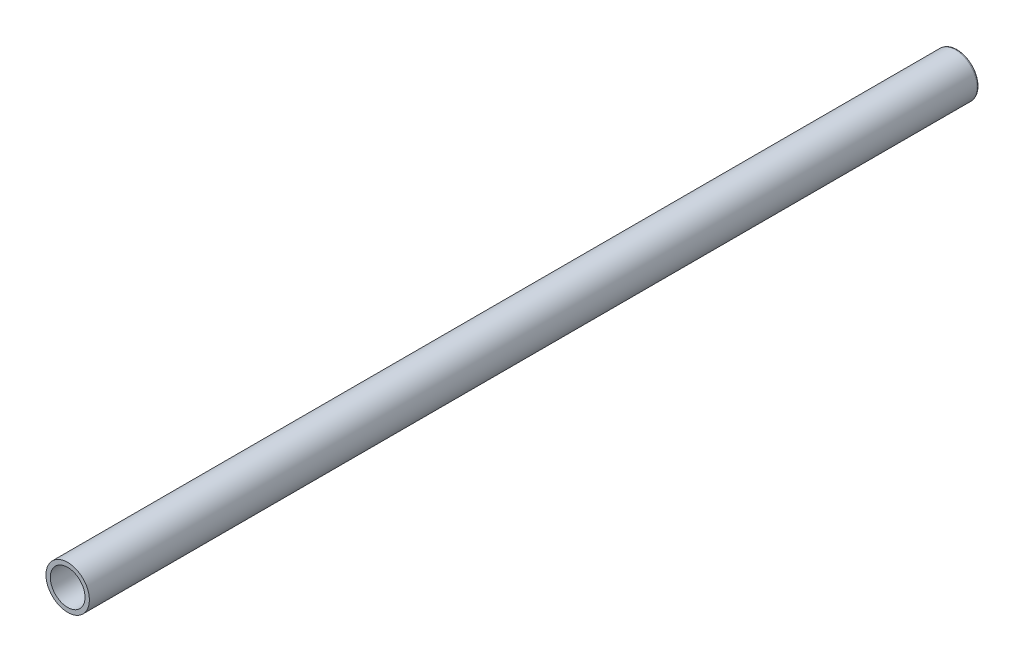
ISO-10303-21;
HEADER;
FILE_DESCRIPTION(('STEP AP214'),'2;1');
FILE_NAME('part.step','',(''),(''),'','','');
FILE_SCHEMA(('AUTOMOTIVE_DESIGN { 1 0 10303 214 1 1 1 1 }'));
ENDSEC;
DATA;
#1=APPLICATION_CONTEXT('core data for automotive mechanical design processes');
#2=APPLICATION_PROTOCOL_DEFINITION('international standard','automotive_design',2000,#1);
#3=PRODUCT_CONTEXT('',#1,'mechanical');
#4=PRODUCT('Part','Part','',(#3));
#5=PRODUCT_RELATED_PRODUCT_CATEGORY('part','',(#4));
#6=PRODUCT_DEFINITION_FORMATION('','',#4);
#7=PRODUCT_DEFINITION_CONTEXT('part definition',#1,'design');
#8=PRODUCT_DEFINITION('design','',#6,#7);
#9=PRODUCT_DEFINITION_SHAPE('','',#8);
#10=(LENGTH_UNIT() NAMED_UNIT(*) SI_UNIT(.MILLI.,.METRE.));
#11=(NAMED_UNIT(*) PLANE_ANGLE_UNIT() SI_UNIT($,.RADIAN.));
#12=(NAMED_UNIT(*) SI_UNIT($,.STERADIAN.) SOLID_ANGLE_UNIT());
#13=UNCERTAINTY_MEASURE_WITH_UNIT(LENGTH_MEASURE(1.E-05),#10,'distance_accuracy_value','');
#14=(GEOMETRIC_REPRESENTATION_CONTEXT(3) GLOBAL_UNCERTAINTY_ASSIGNED_CONTEXT((#13)) GLOBAL_UNIT_ASSIGNED_CONTEXT((#10,
#11,#12)) REPRESENTATION_CONTEXT('',''));
#15=CARTESIAN_POINT('',(0.,0.,0.));
#16=DIRECTION('',(0.,0.,1.));
#17=DIRECTION('',(1.,0.,0.));
#18=AXIS2_PLACEMENT_3D('',#15,#16,#17);
#19=CARTESIAN_POINT('',(0.,5.,124.656399009494));
#20=DIRECTION('',(0.,0.,-1.));
#21=DIRECTION('',(-1.,0.,0.));
#22=AXIS2_PLACEMENT_3D('',#19,#20,#21);
#23=PLANE('',#22);
#24=CARTESIAN_POINT('',(0.,0.,124.656399009494));
#25=DIRECTION('',(0.,0.,1.));
#26=DIRECTION('',(1.,0.,0.));
#27=AXIS2_PLACEMENT_3D('',#24,#25,#26);
#28=CIRCLE('',#27,4.);
#29=CARTESIAN_POINT('',(4.,0.,124.656399009494));
#30=VERTEX_POINT('',#29);
#31=EDGE_CURVE('E42',#30,#30,#28,.T.);
#32=ORIENTED_EDGE('',*,*,#31,.F.);
#33=EDGE_LOOP('',(#32));
#34=FACE_BOUND('',#33,.T.);
#35=CARTESIAN_POINT('',(0.,0.,124.656399009494));
#36=DIRECTION('',(0.,0.,1.));
#37=DIRECTION('',(1.,0.,0.));
#38=AXIS2_PLACEMENT_3D('',#35,#36,#37);
#39=CIRCLE('',#38,5.);
#40=CARTESIAN_POINT('',(5.,0.,124.656399009494));
#41=VERTEX_POINT('',#40);
#42=EDGE_CURVE('E105',#41,#41,#39,.T.);
#43=ORIENTED_EDGE('',*,*,#42,.T.);
#44=EDGE_LOOP('',(#43));
#45=FACE_BOUND('',#44,.T.);
#46=ADVANCED_FACE('F30',(#34,#45),#23,.F.);
#47=CARTESIAN_POINT('',(0.,0.,65.4068878857115));
#48=DIRECTION('',(0.,0.,1.));
#49=DIRECTION('',(1.,0.,0.));
#50=AXIS2_PLACEMENT_3D('',#47,#48,#49);
#51=CYLINDRICAL_SURFACE('',#50,4.);
#52=CARTESIAN_POINT('',(0.,0.,-79.8436009905056));
#53=DIRECTION('',(0.,0.,1.));
#54=DIRECTION('',(1.,0.,0.));
#55=AXIS2_PLACEMENT_3D('',#52,#53,#54);
#56=CIRCLE('',#55,4.);
#57=CARTESIAN_POINT('',(4.,0.,-79.8436009905056));
#58=VERTEX_POINT('',#57);
#59=EDGE_CURVE('E38',#58,#58,#56,.F.);
#60=ORIENTED_EDGE('',*,*,#59,.T.);
#61=EDGE_LOOP('',(#60));
#62=FACE_BOUND('',#61,.T.);
#63=CARTESIAN_POINT('',(-4.,0.,-66.3436009905056));
#64=CARTESIAN_POINT('',(-3.99999906578675,-0.0552507257798206,-66.3435994400135));
#65=CARTESIAN_POINT('',(-3.99884385421219,-0.110518771887176,-66.3390066233231));
#66=CARTESIAN_POINT('',(-3.99434742553262,-0.219470882513688,-66.3207842229676));
#67=CARTESIAN_POINT('',(-3.99100496946646,-0.273154031247157,-66.3071495174804));
#68=CARTESIAN_POINT('',(-3.98250417554693,-0.377347248121716,-66.2713081548642));
#69=CARTESIAN_POINT('',(-3.97734801894725,-0.427861042286669,-66.2491117913621));
#70=CARTESIAN_POINT('',(-3.96576895871729,-0.524448087936284,-66.1968133971424));
#71=CARTESIAN_POINT('',(-3.95934601236034,-0.570521189565836,-66.1667110997597));
#72=CARTESIAN_POINT('',(-3.94578275727868,-0.657867951533942,-66.0988004640695));
#73=CARTESIAN_POINT('',(-3.93863138099022,-0.699037126707379,-66.0608599405329));
#74=CARTESIAN_POINT('',(-3.92449080078353,-0.774499284802203,-65.9786328538997));
#75=CARTESIAN_POINT('',(-3.91750161525565,-0.808791491299424,-65.934345575208));
#76=CARTESIAN_POINT('',(-3.9043651713314,-0.870017695199355,-65.8398708393474));
#77=CARTESIAN_POINT('',(-3.89823196313737,-0.896834810616904,-65.7896055032987));
#78=CARTESIAN_POINT('',(-3.88766329874815,-0.941597939033684,-65.6851020494001));
#79=CARTESIAN_POINT('',(-3.88322757115193,-0.959545370292888,-65.6308645682885));
#80=CARTESIAN_POINT('',(-3.87666984478367,-0.985703224536193,-65.5211053250373));
#81=CARTESIAN_POINT('',(-3.87450327383617,-0.994101512222226,-65.4656310598058));
#82=CARTESIAN_POINT('',(-3.87259575025161,-1.00150785004523,-65.3540219444963));
#83=CARTESIAN_POINT('',(-3.87285440299096,-1.00051742787865,-65.2978872033732));
#84=CARTESIAN_POINT('',(-3.87572803664412,-0.989324349759518,-65.1879904520093));
#85=CARTESIAN_POINT('',(-3.87828575334586,-0.97934556012701,-65.1342039095289));
#86=CARTESIAN_POINT('',(-3.88537806450989,-0.950816124602065,-65.0290936232314));
#87=CARTESIAN_POINT('',(-3.88991279980464,-0.932264868046277,-64.977770055153));
#88=CARTESIAN_POINT('',(-3.90050075936125,-0.886926318624764,-64.8784423130043));
#89=CARTESIAN_POINT('',(-3.90656884979614,-0.860057778155269,-64.8304768759793));
#90=CARTESIAN_POINT('',(-3.91953140564257,-0.798904184009966,-64.7396551840011));
#91=CARTESIAN_POINT('',(-3.9264260155649,-0.764617832539223,-64.6967998251275));
#92=CARTESIAN_POINT('',(-3.94050587026521,-0.688442283120809,-64.616131913376));
#93=CARTESIAN_POINT('',(-3.94769379651981,-0.64636417211057,-64.5784979971314));
#94=CARTESIAN_POINT('',(-3.96137310385857,-0.556407945002462,-64.510786828863));
#95=CARTESIAN_POINT('',(-3.96786446366277,-0.50852965180529,-64.4807098076633));
#96=CARTESIAN_POINT('',(-3.97945154729455,-0.408077259120921,-64.4289005996894));
#97=CARTESIAN_POINT('',(-3.9845424008515,-0.355487595472408,-64.407197430336));
#98=CARTESIAN_POINT('',(-3.99271944660946,-0.247250672095248,-64.3729894533659));
#99=CARTESIAN_POINT('',(-3.99580602226187,-0.191603999433649,-64.3604828862269));
#100=CARTESIAN_POINT('',(-3.9995699951425,-0.0803599802600112,-64.3452959467998));
#101=CARTESIAN_POINT('',(-4.00030702338852,-0.024797813325467,-64.3423723064554));
#102=CARTESIAN_POINT('',(-3.999458698763,0.0860219165343426,-64.345766991876));
#103=CARTESIAN_POINT('',(-3.99787355494564,0.141279506429732,-64.3520844857051));
#104=CARTESIAN_POINT('',(-3.99259720751571,0.249076179184329,-64.3735815960999));
#105=CARTESIAN_POINT('',(-3.98893756123874,0.301643412645838,-64.3886284994903));
#106=CARTESIAN_POINT('',(-3.97992471089423,0.403504861635009,-64.4270057131913));
#107=CARTESIAN_POINT('',(-3.97457133579928,0.452798746021756,-64.4503368600478));
#108=CARTESIAN_POINT('',(-3.96262205284207,0.5476820896199,-64.5050917430888));
#109=CARTESIAN_POINT('',(-3.95600578244621,0.593190294557224,-64.5366517321035));
#110=CARTESIAN_POINT('',(-3.94229672791613,0.678351075762169,-64.6067942630369));
#111=CARTESIAN_POINT('',(-3.93520386167803,0.718002639315342,-64.6453780169169));
#112=CARTESIAN_POINT('',(-3.92112637973847,0.79132704538182,-64.7296022977353));
#113=CARTESIAN_POINT('',(-3.91414869458187,0.824829245081353,-64.7753927925073));
#114=CARTESIAN_POINT('',(-3.90128585584826,0.883673839341796,-64.8720894134828));
#115=CARTESIAN_POINT('',(-3.89540065378017,0.909016596105291,-64.9229953124788));
#116=CARTESIAN_POINT('',(-3.88545396489777,0.950634280406197,-65.0282048054477));
#117=CARTESIAN_POINT('',(-3.88138170194604,0.966962931102713,-65.0824860760683));
#118=CARTESIAN_POINT('',(-3.87551162726789,0.990230439969186,-65.1931407490984));
#119=CARTESIAN_POINT('',(-3.87371331813291,0.997171351652437,-65.249513691194));
#120=CARTESIAN_POINT('',(-3.87263267469305,1.00135906022266,-65.3610150064091));
#121=CARTESIAN_POINT('',(-3.87327955152176,0.998878598520076,-65.4161326139221));
#122=CARTESIAN_POINT('',(-3.87685272671895,0.984918185541907,-65.5251369162843));
#123=CARTESIAN_POINT('',(-3.87977897927904,0.973438415124509,-65.5790236358481));
#124=CARTESIAN_POINT('',(-3.88754173788482,0.941954212961858,-65.6837399632159));
#125=CARTESIAN_POINT('',(-3.89236676824206,0.922000936453576,-65.7345858606658));
#126=CARTESIAN_POINT('',(-3.90338503816553,0.874176609070038,-65.8322445789814));
#127=CARTESIAN_POINT('',(-3.90957846747182,0.846304460022785,-65.8790568392969));
#128=CARTESIAN_POINT('',(-3.92283756175675,0.782578499091417,-65.9686374098403));
#129=CARTESIAN_POINT('',(-3.92992176554505,0.746535441941495,-66.0112683727883));
#130=CARTESIAN_POINT('',(-3.94405351497524,0.667859580793146,-66.0899656870359));
#131=CARTESIAN_POINT('',(-3.95110105151373,0.625225214174086,-66.1260304772476));
#132=CARTESIAN_POINT('',(-3.96451770431775,0.533645057801717,-66.1912085295487));
#133=CARTESIAN_POINT('',(-3.97087222243912,0.484598948210917,-66.2201840662867));
#134=CARTESIAN_POINT('',(-3.98203283316746,0.382177373006981,-66.269432632466));
#135=CARTESIAN_POINT('',(-3.98684003466521,0.328805042291158,-66.2897118976047));
#136=CARTESIAN_POINT('',(-3.99365373043694,0.229606835495648,-66.3179822107254));
#137=CARTESIAN_POINT('',(-3.9960172336846,0.184253447272045,-66.3275684858746));
#138=CARTESIAN_POINT('',(-3.99919070154632,0.0926040476908553,-66.3403782862536));
#139=CARTESIAN_POINT('',(-4.00000078300596,0.0463081074950777,-66.3436022900425));
#140=CARTESIAN_POINT('',(-4.,0.,-66.3436009905056));
#141=B_SPLINE_CURVE_WITH_KNOTS('',3,(#63,#64,#65,#66,#67,#68,#69,#70,#71,#72,#73,#74,#75,#76,
#77,#78,#79,#80,#81,#82,#83,#84,#85,#86,#87,#88,#89,#90,#91,#92,#93,#94,#95,#96,#97,#98,#99,
#100,#101,#102,#103,#104,#105,#106,#107,#108,#109,#110,#111,#112,#113,#114,#115,#116,#117,#118,
#119,#120,#121,#122,#123,#124,#125,#126,#127,#128,#129,#130,#131,#132,#133,#134,#135,#136,#137,
#138,#139,#140),.UNSPECIFIED.,.T.,.F.,(4,2,2,2,2,2,2,2,2,2,2,2,2,2,2,2,2,2,2,2,2,2,2,2,2,2,2,2,
2,2,2,2,2,2,2,2,2,2,4),(0.,0.165582474981259,0.331258825175934,0.496736601524068,
0.662219960112885,0.83076290291426,0.999324863867076,1.17039098363871,1.34142974112913,
1.50904196732955,1.67662692075131,1.84014998004679,2.00368468977359,2.16887018582586,
2.33408460557441,2.50401000646013,2.67394059705498,2.84445486006076,3.01493649125762,
3.18105539299517,3.34715934075161,3.51080183009357,3.67446084881526,3.84102391710234,
4.00761575338679,4.17829672802983,4.34897012499671,4.51861503076026,4.68822282168272,
4.85295853599076,5.01769093970689,5.18144267039631,5.34521712091268,5.51326384273274,
5.68135046513612,5.85248123666391,6.02348909214232,6.16228161961431,6.30106370695358),.UNSPECIFIED.);
#142=CARTESIAN_POINT('',(-4.,0.,-66.3436009905056));
#143=VERTEX_POINT('',#142);
#144=EDGE_CURVE('E52',#143,#143,#141,.T.);
#145=ORIENTED_EDGE('',*,*,#144,.T.);
#146=EDGE_LOOP('',(#145));
#147=FACE_BOUND('',#146,.T.);
#148=CARTESIAN_POINT('',(0.,-4.,-62.8436009905056));
#149=CARTESIAN_POINT('',(-0.0812350589378531,-4.00000217456151,-62.8435980882025));
#150=CARTESIAN_POINT('',(-0.162450241781792,-3.99750379283184,-62.850220750754));
#151=CARTESIAN_POINT('',(-0.322453452352362,-3.98778696006928,-62.8764291857756));
#152=CARTESIAN_POINT('',(-0.401241827987617,-3.98056918893993,-62.8960130909762));
#153=CARTESIAN_POINT('',(-0.554060784990879,-3.96218832391545,-62.9473539922774));
#154=CARTESIAN_POINT('',(-0.628100224162276,-3.9510328434944,-62.9790875073274));
#155=CARTESIAN_POINT('',(-0.769799310160251,-3.92588767765353,-63.0537074035215));
#156=CARTESIAN_POINT('',(-0.837457239177879,-3.91189723227548,-63.0965967760498));
#157=CARTESIAN_POINT('',(-0.967346417045828,-3.88186246971217,-63.1942135215765));
#158=CARTESIAN_POINT('',(-1.02927073015119,-3.86576002583566,-63.249331252765));
#159=CARTESIAN_POINT('',(-1.14324421474363,-3.83360220871327,-63.3690114251645));
#160=CARTESIAN_POINT('',(-1.19529036359203,-3.81754685135033,-63.4335767465935));
#161=CARTESIAN_POINT('',(-1.28998202215985,-3.78662470617731,-63.5733184580289));
#162=CARTESIAN_POINT('',(-1.3321939319576,-3.77182648820818,-63.6488053570515));
#163=CARTESIAN_POINT('',(-1.40318646334084,-3.74599860237433,-63.8064493446742));
#164=CARTESIAN_POINT('',(-1.43197244961239,-3.73496742975881,-63.8886037536607));
#165=CARTESIAN_POINT('',(-1.47408431017549,-3.71854412824136,-64.0537177307638));
#166=CARTESIAN_POINT('',(-1.48799593218558,-3.71293924350838,-64.1365060289411));
#167=CARTESIAN_POINT('',(-1.50179556531648,-3.70738061461215,-64.3034171484995));
#168=CARTESIAN_POINT('',(-1.50168936802631,-3.70742453659305,-64.3875394043801));
#169=CARTESIAN_POINT('',(-1.48790429610018,-3.71297511632055,-64.5493705157186));
#170=CARTESIAN_POINT('',(-1.47503808509003,-3.71815468871122,-64.6271618965498));
#171=CARTESIAN_POINT('',(-1.4374416786833,-3.7328493805953,-64.779388140911));
#172=CARTESIAN_POINT('',(-1.41270969663258,-3.74236515298863,-64.8538224971195));
#173=CARTESIAN_POINT('',(-1.35163748571903,-3.76485702190253,-64.9988780582339));
#174=CARTESIAN_POINT('',(-1.315086487371,-3.77789517988166,-65.0694004766269));
#175=CARTESIAN_POINT('',(-1.23156073762698,-3.80594210139319,-65.2035467280966));
#176=CARTESIAN_POINT('',(-1.18458238728897,-3.82095154457158,-65.2671681680253));
#177=CARTESIAN_POINT('',(-1.07781780766549,-3.85248038859113,-65.3902046541565));
#178=CARTESIAN_POINT('',(-1.01738298716955,-3.86903347455671,-65.4490496312537));
#179=CARTESIAN_POINT('',(-0.887312590819016,-3.90091728164086,-65.5559389567114));
#180=CARTESIAN_POINT('',(-0.81767560349736,-3.91624781465952,-65.6039816451113));
#181=CARTESIAN_POINT('',(-0.669723436992418,-3.9442639480908,-65.6885313875682));
#182=CARTESIAN_POINT('',(-0.591290713844718,-3.95690498259616,-65.7248485717267));
#183=CARTESIAN_POINT('',(-0.428836850524584,-3.97778718326962,-65.7835835947757));
#184=CARTESIAN_POINT('',(-0.344818210845769,-3.98603030341493,-65.8060076070668));
#185=CARTESIAN_POINT('',(-0.178375243148668,-3.99684443228065,-65.8352237780476));
#186=CARTESIAN_POINT('',(-0.0961036195622116,-3.99969369025686,-65.8427835968881));
#187=CARTESIAN_POINT('',(0.0685724752550238,-4.00025893700126,-65.8442920544055));
#188=CARTESIAN_POINT('',(0.150976912983374,-3.99797606386863,-65.8382437108224));
#189=CARTESIAN_POINT('',(0.31026204856186,-3.98871709772643,-65.813290948197));
#190=CARTESIAN_POINT('',(0.387233328007335,-3.98192470962305,-65.7948894467686));
#191=CARTESIAN_POINT('',(0.536941754957219,-3.96451477091717,-65.7464149179583));
#192=CARTESIAN_POINT('',(0.609678350347532,-3.9538967228203,-65.7163403725576));
#193=CARTESIAN_POINT('',(0.751247765110154,-3.92949624407682,-65.6444145780662));
#194=CARTESIAN_POINT('',(0.819903083557795,-3.91563000209348,-65.6022432612823));
#195=CARTESIAN_POINT('',(0.949392711726625,-3.88626671564664,-65.5076828873341));
#196=CARTESIAN_POINT('',(1.01022412027045,-3.87076907009516,-65.4552900579605));
#197=CARTESIAN_POINT('',(1.12603079874454,-3.8387332949099,-65.3381968683814));
#198=CARTESIAN_POINT('',(1.18046154123568,-3.82218696503729,-65.2729588077329));
#199=CARTESIAN_POINT('',(1.27771050031903,-3.79078815746854,-65.133949605798));
#200=CARTESIAN_POINT('',(1.32052767414519,-3.77593583194399,-65.0601776991171));
#201=CARTESIAN_POINT('',(1.39337773518998,-3.74966829822463,-64.9055850037333));
#202=CARTESIAN_POINT('',(1.42335685446918,-3.73826760328493,-64.8247362445952));
#203=CARTESIAN_POINT('',(1.46907883466889,-3.72054032891005,-64.6585912268178));
#204=CARTESIAN_POINT('',(1.48483050305535,-3.71421061057491,-64.5732977543075));
#205=CARTESIAN_POINT('',(1.50086347097839,-3.70775894792573,-64.4065848309645));
#206=CARTESIAN_POINT('',(1.50207331495837,-3.70726444523341,-64.3252683587887));
#207=CARTESIAN_POINT('',(1.49136715641593,-3.71158412745292,-64.1636556742295));
#208=CARTESIAN_POINT('',(1.47945239850124,-3.71639780898899,-64.0833593658341));
#209=CARTESIAN_POINT('',(1.44355815630241,-3.73048141585433,-63.9285537637891));
#210=CARTESIAN_POINT('',(1.41995798316524,-3.73961085376663,-63.8539426442603));
#211=CARTESIAN_POINT('',(1.3616969677992,-3.76121548297845,-63.7096954820112));
#212=CARTESIAN_POINT('',(1.32703332944945,-3.77369151995215,-63.6400607024355));
#213=CARTESIAN_POINT('',(1.24552075938154,-3.80139723903964,-63.503774200808));
#214=CARTESIAN_POINT('',(1.1981283280301,-3.81673698440964,-63.4374701937057));
#215=CARTESIAN_POINT('',(1.09334485729906,-3.84806246757177,-63.3134594295344));
#216=CARTESIAN_POINT('',(1.03595064012808,-3.86404840943145,-63.2557554157189));
#217=CARTESIAN_POINT('',(0.909080396784621,-3.89590424609881,-63.1473990346838));
#218=CARTESIAN_POINT('',(0.839118644212987,-3.91172104900645,-63.097297237071));
#219=CARTESIAN_POINT('',(0.691213223200817,-3.94054514457031,-63.0095783352291));
#220=CARTESIAN_POINT('',(0.613268934090621,-3.95355221851559,-62.9719622027693));
#221=CARTESIAN_POINT('',(0.447999082002313,-3.9757429260668,-62.9092241614573));
#222=CARTESIAN_POINT('',(0.360413422234208,-3.98473657158356,-62.8847139259037));
#223=CARTESIAN_POINT('',(0.18187573360638,-3.99686242179587,-62.851908030585));
#224=CARTESIAN_POINT('',(0.0909254163648578,-3.99999756603967,-62.8436042390183));
#225=CARTESIAN_POINT('',(0.,-4.,-62.8436009905056));
#226=B_SPLINE_CURVE_WITH_KNOTS('',3,(#148,#149,#150,#151,#152,#153,#154,#155,#156,#157,#158,
#159,#160,#161,#162,#163,#164,#165,#166,#167,#168,#169,#170,#171,#172,#173,#174,#175,#176,#177,
#178,#179,#180,#181,#182,#183,#184,#185,#186,#187,#188,#189,#190,#191,#192,#193,#194,#195,#196,
#197,#198,#199,#200,#201,#202,#203,#204,#205,#206,#207,#208,#209,#210,#211,#212,#213,#214,#215,
#216,#217,#218,#219,#220,#221,#222,#223,#224,#225),.UNSPECIFIED.,.T.,.F.,(4,2,2,2,2,2,2,2,2,2,2,
2,2,2,2,2,2,2,2,2,2,2,2,2,2,2,2,2,2,2,2,2,2,2,2,2,2,2,4),(0.,0.243369801560561,
0.486704549530459,0.729571369213573,0.972503379609487,1.22473618582715,1.47704604925623,
1.7389667450166,2.00078269352134,2.25185874416902,2.50283106079708,2.73878345119972,
2.97477138060591,3.21522408387019,3.45575990744259,3.71246153335814,3.96920257905066,
4.22991375286076,4.49050899698846,4.73725019635926,4.98393668390521,5.2211443792384,
5.45838293254454,5.70259221859599,5.94689180019868,6.20536519455659,6.46386178920142,
6.72343066727204,6.98283874956506,7.22558763480252,7.4683135021126,7.70363142426533,
7.93900886656507,8.18672471884272,8.43451941997062,8.6957232965404,8.95694749805102,
9.22948515032043,9.50188601796128),.UNSPECIFIED.);
#227=CARTESIAN_POINT('',(0.,-4.,-62.8436009905056));
#228=VERTEX_POINT('',#227);
#229=EDGE_CURVE('E73',#228,#228,#226,.T.);
#230=ORIENTED_EDGE('',*,*,#229,.T.);
#231=EDGE_LOOP('',(#230));
#232=FACE_BOUND('',#231,.T.);
#233=ORIENTED_EDGE('',*,*,#31,.T.);
#234=EDGE_LOOP('',(#233));
#235=FACE_BOUND('',#234,.T.);
#236=ADVANCED_FACE('F77',(#62,#147,#232,#235),#51,.F.);
#237=CARTESIAN_POINT('',(0.,0.,65.4068878857115));
#238=DIRECTION('',(0.,0.,1.));
#239=DIRECTION('',(1.,0.,0.));
#240=AXIS2_PLACEMENT_3D('',#237,#238,#239);
#241=CYLINDRICAL_SURFACE('',#240,5.);
#242=CARTESIAN_POINT('',(0.,0.,-79.8436009905056));
#243=DIRECTION('',(0.,0.,1.));
#244=DIRECTION('',(1.,0.,0.));
#245=AXIS2_PLACEMENT_3D('',#242,#243,#244);
#246=CIRCLE('',#245,5.);
#247=CARTESIAN_POINT('',(5.,0.,-79.8436009905056));
#248=VERTEX_POINT('',#247);
#249=EDGE_CURVE('E10',#248,#248,#246,.T.);
#250=ORIENTED_EDGE('',*,*,#249,.T.);
#251=EDGE_LOOP('',(#250));
#252=FACE_BOUND('',#251,.T.);
#253=CARTESIAN_POINT('',(-5.,0.,-66.3436009905056));
#254=CARTESIAN_POINT('',(-4.99999897580871,0.0555769067926332,-66.3435989460073));
#255=CARTESIAN_POINT('',(-4.99906385178231,0.111179660201522,-66.338952147538));
#256=CARTESIAN_POINT('',(-4.99542365623231,0.220813507689019,-66.3205024903904));
#257=CARTESIAN_POINT('',(-4.99271717860186,0.274843317541355,-66.3066923577041));
#258=CARTESIAN_POINT('',(-4.98583649278287,0.379730305263311,-66.2703597168849));
#259=CARTESIAN_POINT('',(-4.98166369076718,0.430590467933132,-66.247845553661));
#260=CARTESIAN_POINT('',(-4.97230398035314,0.527807988864222,-66.1947687429943));
#261=CARTESIAN_POINT('',(-4.96711713235707,0.574165615075807,-66.1642065748984));
#262=CARTESIAN_POINT('',(-4.9562216532997,0.661693477314861,-66.0954624962142));
#263=CARTESIAN_POINT('',(-4.95050745504347,0.702793951158523,-66.0571926351144));
#264=CARTESIAN_POINT('',(-4.93924180452588,0.778036756608029,-65.9743085741139));
#265=CARTESIAN_POINT('',(-4.93369036500424,0.812178544770424,-65.9296938791705));
#266=CARTESIAN_POINT('',(-4.92332441812615,0.872831753347618,-65.8348847974938));
#267=CARTESIAN_POINT('',(-4.91851707364946,0.899270938865864,-65.7846433467093));
#268=CARTESIAN_POINT('',(-4.91026268058418,0.943305666580306,-65.6803191715016));
#269=CARTESIAN_POINT('',(-4.90681549761962,0.960902082437236,-65.6262368271593));
#270=CARTESIAN_POINT('',(-4.90172805252205,0.986525299884824,-65.5165166265977));
#271=CARTESIAN_POINT('',(-4.90006470107188,0.994674497958775,-65.4609084463634));
#272=CARTESIAN_POINT('',(-4.89866375060627,1.00155212772612,-65.3490911691413));
#273=CARTESIAN_POINT('',(-4.89892595467841,1.0002815227135,-65.2928821341855));
#274=CARTESIAN_POINT('',(-4.90132551148185,0.988454573101819,-65.1823542024846));
#275=CARTESIAN_POINT('',(-4.90343452858764,0.978038540243907,-65.1280195848783));
#276=CARTESIAN_POINT('',(-4.90924546160001,0.948437884623052,-65.0218849138426));
#277=CARTESIAN_POINT('',(-4.91294745357779,0.929252843100683,-64.9700849815866));
#278=CARTESIAN_POINT('',(-4.92155618500408,0.88252478367472,-64.870085728802));
#279=CARTESIAN_POINT('',(-4.92647089813705,0.854926151232111,-64.8219131109365));
#280=CARTESIAN_POINT('',(-4.93694618773062,0.792193574572674,-64.7308301405328));
#281=CARTESIAN_POINT('',(-4.94250683838366,0.757058764356825,-64.6879203936545));
#282=CARTESIAN_POINT('',(-4.95377021241462,0.679499934560579,-64.6077715880487));
#283=CARTESIAN_POINT('',(-4.95947369210905,0.636956161212439,-64.5706484226465));
#284=CARTESIAN_POINT('',(-4.97028848714409,0.546185024062006,-64.5040471442044));
#285=CARTESIAN_POINT('',(-4.97539979488974,0.497957587379388,-64.4745691292121));
#286=CARTESIAN_POINT('',(-4.98446690160887,0.397059386878923,-64.4240734812797));
#287=CARTESIAN_POINT('',(-4.98842088848272,0.344381819585303,-64.4030690968611));
#288=CARTESIAN_POINT('',(-4.99471408987858,0.236148976448667,-64.3702405164671));
#289=CARTESIAN_POINT('',(-4.99705350000531,0.180594050072451,-64.358415208432));
#290=CARTESIAN_POINT('',(-4.99982671866868,0.0691794056271518,-64.3444445367114));
#291=CARTESIAN_POINT('',(-5.0002917465247,0.013340328325578,-64.3421405709654));
#292=CARTESIAN_POINT('',(-4.99935051930103,-0.0979249341927115,-64.3468508494478));
#293=CARTESIAN_POINT('',(-4.99794436941446,-0.15335114244379,-64.3538645698582));
#294=CARTESIAN_POINT('',(-4.99343832008018,-0.261705659946539,-64.3768793640496));
#295=CARTESIAN_POINT('',(-4.99035376404206,-0.314651948339902,-64.3927990590035));
#296=CARTESIAN_POINT('',(-4.98283552061033,-0.417123627499666,-64.4330849731614));
#297=CARTESIAN_POINT('',(-4.97840173214227,-0.466648761637537,-64.4574518251825));
#298=CARTESIAN_POINT('',(-4.96859911533295,-0.561541173686216,-64.514283481157));
#299=CARTESIAN_POINT('',(-4.96321950437052,-0.606850126752188,-64.5468437715446));
#300=CARTESIAN_POINT('',(-4.95214734829882,-0.691418019119205,-64.6190101817129));
#301=CARTESIAN_POINT('',(-4.94645476968388,-0.730676308930757,-64.6586170569055));
#302=CARTESIAN_POINT('',(-4.93529303556965,-0.802640590774168,-64.7444743423968));
#303=CARTESIAN_POINT('',(-4.92982860233304,-0.835237702448649,-64.790816734727));
#304=CARTESIAN_POINT('',(-4.91984191796194,-0.892185420051201,-64.8884123518623));
#305=CARTESIAN_POINT('',(-4.91531962913343,-0.916536355922899,-64.9396653800792));
#306=CARTESIAN_POINT('',(-4.90776740584383,-0.956151841581957,-65.0453692366552));
#307=CARTESIAN_POINT('',(-4.90472974872187,-0.971463499791047,-65.099801831716));
#308=CARTESIAN_POINT('',(-4.90047436792025,-0.992708651627194,-65.2105344439965));
#309=CARTESIAN_POINT('',(-4.89925640691112,-0.99864336822511,-65.266834216715));
#310=CARTESIAN_POINT('',(-4.89879149631379,-1.00092091086747,-65.37860985505));
#311=CARTESIAN_POINT('',(-4.89950919189301,-0.997435788070894,-65.4340821394327));
#312=CARTESIAN_POINT('',(-4.90275573484614,-0.981352304100058,-65.5436326404107));
#313=CARTESIAN_POINT('',(-4.90528456767169,-0.968754016129296,-65.5977108682005));
#314=CARTESIAN_POINT('',(-4.91185264219159,-0.934878568498952,-65.7028287017462));
#315=CARTESIAN_POINT('',(-4.91588821018831,-0.913622506717342,-65.753875351008));
#316=CARTESIAN_POINT('',(-4.9250171497417,-0.863054644601605,-65.8517047112401));
#317=CARTESIAN_POINT('',(-4.93011060998894,-0.833742168774884,-65.8984870642308));
#318=CARTESIAN_POINT('',(-4.94088960523225,-0.767305914786414,-65.9873165626559));
#319=CARTESIAN_POINT('',(-4.946583729097,-0.730057887235177,-66.0292697557732));
#320=CARTESIAN_POINT('',(-4.95786081871955,-0.649064369013136,-66.1063871960348));
#321=CARTESIAN_POINT('',(-4.96344375863185,-0.605317387153331,-66.1415498808229));
#322=CARTESIAN_POINT('',(-4.97393832387971,-0.512017629088245,-66.2044356344521));
#323=CARTESIAN_POINT('',(-4.97884231219246,-0.462408884429834,-66.2320769937857));
#324=CARTESIAN_POINT('',(-4.98735125085,-0.359166360940732,-66.2785871131022));
#325=CARTESIAN_POINT('',(-4.99095737138616,-0.305536260863126,-66.2974637800381));
#326=CARTESIAN_POINT('',(-4.99576372595371,-0.20982148892378,-66.3222529385503));
#327=CARTESIAN_POINT('',(-4.99734303158452,-0.168281664013785,-66.3302441842134));
#328=CARTESIAN_POINT('',(-4.99946154139893,-0.0844995252100666,-66.340918902864));
#329=CARTESIAN_POINT('',(-5.00000077873155,-0.0422572337486188,-66.3436025450154));
#330=CARTESIAN_POINT('',(-5.,0.,-66.3436009905056));
#331=B_SPLINE_CURVE_WITH_KNOTS('',3,(#253,#254,#255,#256,#257,#258,#259,#260,#261,#262,#263,
#264,#265,#266,#267,#268,#269,#270,#271,#272,#273,#274,#275,#276,#277,#278,#279,#280,#281,#282,
#283,#284,#285,#286,#287,#288,#289,#290,#291,#292,#293,#294,#295,#296,#297,#298,#299,#300,#301,
#302,#303,#304,#305,#306,#307,#308,#309,#310,#311,#312,#313,#314,#315,#316,#317,#318,#319,#320,
#321,#322,#323,#324,#325,#326,#327,#328,#329,#330),.UNSPECIFIED.,.T.,.F.,(4,2,2,2,2,2,2,2,2,2,2,
2,2,2,2,2,2,2,2,2,2,2,2,2,2,2,2,2,2,2,2,2,2,2,2,2,2,2,4),(0.,0.16657613066126,0.333284650691321,
0.499833735250335,0.666372902230861,0.834932670112188,1.00350559674737,1.17361195005921,
1.34370149365197,1.51156185103587,1.67940504281224,1.84471727006277,2.01003739253728,
2.17647490203593,2.34293154749671,2.5123825249135,2.68183567539819,2.85155274854023,
3.02124925698035,3.18810735676264,3.35495607657866,3.52030453950722,3.68566539216022,
3.85305066033358,4.02045388345928,4.19040628579224,4.36035188723465,4.5294038103272,
4.69843368330414,4.86439722567702,5.03035943492608,5.19591961253108,5.36149367581865,
5.52988076239142,5.6983065453293,5.86849496675636,6.03852955517517,6.16518775289893,
6.29184191370995),.UNSPECIFIED.);
#332=CARTESIAN_POINT('',(-5.,0.,-66.3436009905056));
#333=VERTEX_POINT('',#332);
#334=EDGE_CURVE('E45',#333,#333,#331,.T.);
#335=ORIENTED_EDGE('',*,*,#334,.T.);
#336=EDGE_LOOP('',(#335));
#337=FACE_BOUND('',#336,.T.);
#338=CARTESIAN_POINT('',(0.,-5.,-62.8436009905056));
#339=CARTESIAN_POINT('',(0.0822886127533003,-4.9999992925055,-62.8436019879905));
#340=CARTESIAN_POINT('',(0.164587318351529,-4.99794915693954,-62.8503948541296));
#341=CARTESIAN_POINT('',(0.326788125304881,-4.98997105593691,-62.8773223447277));
#342=CARTESIAN_POINT('',(0.406689504411421,-4.98404193389692,-62.897460948529));
#343=CARTESIAN_POINT('',(0.561732707754527,-4.96895552501836,-62.9503470074159));
#344=CARTESIAN_POINT('',(0.636881364395371,-4.95980300250426,-62.9830758601246));
#345=CARTESIAN_POINT('',(0.78062418105313,-4.93922109237645,-63.0601370835615));
#346=CARTESIAN_POINT('',(0.84921746746967,-4.92779140192067,-63.104470997901));
#347=CARTESIAN_POINT('',(0.979871797183746,-4.90350737192774,-63.2048249979783));
#348=CARTESIAN_POINT('',(1.04171807124434,-4.89062383657036,-63.2611176163916));
#349=CARTESIAN_POINT('',(1.15524920923324,-4.86505834210442,-63.3832102204158));
#350=CARTESIAN_POINT('',(1.20693236327441,-4.85237641724501,-63.4490118026306));
#351=CARTESIAN_POINT('',(1.29980037723708,-4.82834113993772,-63.5900717435433));
#352=CARTESIAN_POINT('',(1.34072309022214,-4.81702406663875,-63.6655094514964));
#353=CARTESIAN_POINT('',(1.40921394774761,-4.79743620394031,-63.8225902447359));
#354=CARTESIAN_POINT('',(1.43678529919973,-4.78916468313311,-63.9042318344336));
#355=CARTESIAN_POINT('',(1.47701633682652,-4.77690870838434,-64.0689912566361));
#356=CARTESIAN_POINT('',(1.49007196234677,-4.77281069324533,-64.1520037343696));
#357=CARTESIAN_POINT('',(1.50213730614672,-4.76902789749767,-64.3191341467224));
#358=CARTESIAN_POINT('',(1.50115042761078,-4.76934204760571,-64.4032518085647));
#359=CARTESIAN_POINT('',(1.48546977199812,-4.77424744067778,-64.5669848991141));
#360=CARTESIAN_POINT('',(1.47127205262685,-4.77868388599141,-64.6466532408679));
#361=CARTESIAN_POINT('',(1.43037420427056,-4.79108356228624,-64.8024207767791));
#362=CARTESIAN_POINT('',(1.40367284141641,-4.79904714132351,-64.87851961788));
#363=CARTESIAN_POINT('',(1.33816026653682,-4.81772733074973,-65.0262013401664));
#364=CARTESIAN_POINT('',(1.29918816934643,-4.82848016115952,-65.0977080744609));
#365=CARTESIAN_POINT('',(1.21035222588683,-4.85150987000065,-65.2333330125158));
#366=CARTESIAN_POINT('',(1.16048574002588,-4.86378711746991,-65.2974494199194));
#367=CARTESIAN_POINT('',(1.04881290765546,-4.88911011297938,-65.4192871812677));
#368=CARTESIAN_POINT('',(0.986594907466969,-4.90216654310498,-65.4766296545353));
#369=CARTESIAN_POINT('',(0.853263259313971,-4.92712244063259,-65.5801549745699));
#370=CARTESIAN_POINT('',(0.782149051860894,-4.9390218351841,-65.6263371189201));
#371=CARTESIAN_POINT('',(0.63235503834281,-4.9604316006947,-65.7064609129704));
#372=CARTESIAN_POINT('',(0.553627749747955,-4.96992543668314,-65.7403185067555));
#373=CARTESIAN_POINT('',(0.391245415603522,-4.98533521832222,-65.7942005806053));
#374=CARTESIAN_POINT('',(0.307591751589585,-4.99125216186999,-65.8142289190381));
#375=CARTESIAN_POINT('',(0.140952242668335,-4.99868364643538,-65.839253168405));
#376=CARTESIAN_POINT('',(0.0580500976011898,-5.0003485041779,-65.8447625763072));
#377=CARTESIAN_POINT('',(-0.107499605823381,-4.9995292324176,-65.8420318347936));
#378=CARTESIAN_POINT('',(-0.190147196690779,-4.99704565677757,-65.8337935208542));
#379=CARTESIAN_POINT('',(-0.350903605309697,-4.98830696987163,-65.8042163793941));
#380=CARTESIAN_POINT('',(-0.429072772614172,-4.98213829799417,-65.7831776029248));
#381=CARTESIAN_POINT('',(-0.580754638954524,-4.96674347841533,-65.7289577577274));
#382=CARTESIAN_POINT('',(-0.654266777025583,-4.95751696321085,-65.6957752294678));
#383=CARTESIAN_POINT('',(-0.796437189461051,-4.93669654351325,-65.6173478250245));
#384=CARTESIAN_POINT('',(-0.86494382619967,-4.92505280829675,-65.5718416495577));
#385=CARTESIAN_POINT('',(-0.993523307980147,-4.90073468764318,-65.4703762364528));
#386=CARTESIAN_POINT('',(-1.05359403235593,-4.8880600443108,-65.414414378618));
#387=CARTESIAN_POINT('',(-1.16585744551026,-4.86253171869138,-65.2912136821363));
#388=CARTESIAN_POINT('',(-1.21768481231503,-4.84968825033268,-65.2236391147339));
#389=CARTESIAN_POINT('',(-1.30928995072153,-4.82576515238464,-65.0804730514921));
#390=CARTESIAN_POINT('',(-1.34906803829472,-4.81468547654651,-65.0048817659474));
#391=CARTESIAN_POINT('',(-1.41517347127169,-4.79567189615055,-64.8480684992509));
#392=CARTESIAN_POINT('',(-1.4415634693705,-4.78772337843827,-64.766874803969));
#393=CARTESIAN_POINT('',(-1.48021730815114,-4.77591594362794,-64.6009130215742));
#394=CARTESIAN_POINT('',(-1.49248598978779,-4.772055625083,-64.516146169718));
#395=CARTESIAN_POINT('',(-1.50221984485059,-4.76899972496087,-64.3492394721294));
#396=CARTESIAN_POINT('',(-1.5002805530849,-4.76961647442755,-64.2671373394881));
#397=CARTESIAN_POINT('',(-1.48307505444814,-4.77499401288294,-64.1044868871328));
#398=CARTESIAN_POINT('',(-1.46780938124716,-4.77975463592551,-64.0239385053293));
#399=CARTESIAN_POINT('',(-1.42476888804136,-4.79275763670386,-63.8676555913628));
#400=CARTESIAN_POINT('',(-1.39715175507069,-4.80095604545965,-63.7918737031439));
#401=CARTESIAN_POINT('',(-1.33031507121129,-4.81990278909136,-63.6459585516879));
#402=CARTESIAN_POINT('',(-1.29109329962877,-4.83065161194312,-63.5758263728649));
#403=CARTESIAN_POINT('',(-1.20048763805073,-4.85397676425833,-63.4404378739785));
#404=CARTESIAN_POINT('',(-1.14871276092994,-4.86660540163798,-63.3754522292452));
#405=CARTESIAN_POINT('',(-1.03517434629782,-4.89201320450026,-63.2548984921978));
#406=CARTESIAN_POINT('',(-0.973408217134508,-4.90479240823905,-63.1993328510379));
#407=CARTESIAN_POINT('',(-0.839465762183257,-4.92950936570649,-63.0975775782106));
#408=CARTESIAN_POINT('',(-0.767037885790615,-4.94141159765674,-63.0517095436501));
#409=CARTESIAN_POINT('',(-0.615141373983531,-4.96260680455813,-62.9728658206016));
#410=CARTESIAN_POINT('',(-0.535676052998953,-4.97190099931067,-62.9398841022311));
#411=CARTESIAN_POINT('',(-0.380757712655278,-4.98602174969301,-62.8907057148529));
#412=CARTESIAN_POINT('',(-0.305786961954232,-4.99122027381068,-62.8730893176224));
#413=CARTESIAN_POINT('',(-0.153880195230779,-4.99820944494492,-62.8495374652641));
#414=CARTESIAN_POINT('',(-0.0769445098581389,-5.0000006615474,-62.8436000578008));
#415=CARTESIAN_POINT('',(0.,-5.,-62.8436009905056));
#416=B_SPLINE_CURVE_WITH_KNOTS('',3,(#338,#339,#340,#341,#342,#343,#344,#345,#346,#347,#348,
#349,#350,#351,#352,#353,#354,#355,#356,#357,#358,#359,#360,#361,#362,#363,#364,#365,#366,#367,
#368,#369,#370,#371,#372,#373,#374,#375,#376,#377,#378,#379,#380,#381,#382,#383,#384,#385,#386,
#387,#388,#389,#390,#391,#392,#393,#394,#395,#396,#397,#398,#399,#400,#401,#402,#403,#404,#405,
#406,#407,#408,#409,#410,#411,#412,#413,#414,#415),.UNSPECIFIED.,.T.,.F.,(4,2,2,2,2,2,2,2,2,2,2,
2,2,2,2,2,2,2,2,2,2,2,2,2,2,2,2,2,2,2,2,2,2,2,2,2,2,2,4),(0.,0.246583203612611,
0.493239964845998,0.739533676300873,0.985860164412703,1.23855602948192,1.49129437288633,
1.74971481004109,2.00807314543223,2.25919689356599,2.5102597831909,2.75226016697677,
2.99428443658001,3.23962426447121,3.48502360158557,3.74067104048166,3.99633456531071,
4.25371046881689,4.51101453528808,4.75908809438545,5.00712853550327,5.24956746682327,
5.49203554593729,5.74011305702908,5.98825282000191,6.24540400322818,6.50254844252682,
6.75847814951253,7.01432009460284,7.25950155466942,7.504673196616,7.74680040402722,
7.98897397553107,8.23996925679931,8.49102974897502,8.74942996156671,9.00770911595236,
9.2383169193046,9.46888616948875),.UNSPECIFIED.);
#417=CARTESIAN_POINT('',(0.,-5.,-62.8436009905056));
#418=VERTEX_POINT('',#417);
#419=EDGE_CURVE('E53',#418,#418,#416,.T.);
#420=ORIENTED_EDGE('',*,*,#419,.T.);
#421=EDGE_LOOP('',(#420));
#422=FACE_BOUND('',#421,.T.);
#423=ORIENTED_EDGE('',*,*,#42,.F.);
#424=EDGE_LOOP('',(#423));
#425=FACE_BOUND('',#424,.T.);
#426=ADVANCED_FACE('F58',(#252,#337,#422,#425),#241,.T.);
#427=CARTESIAN_POINT('',(0.,-10.,-64.3436009905056));
#428=DIRECTION('',(0.,1.,0.));
#429=DIRECTION('',(0.,0.,1.));
#430=AXIS2_PLACEMENT_3D('',#427,#428,#429);
#431=CYLINDRICAL_SURFACE('',#430,1.5);
#432=ORIENTED_EDGE('',*,*,#419,.F.);
#433=EDGE_LOOP('',(#432));
#434=FACE_BOUND('',#433,.T.);
#435=ORIENTED_EDGE('',*,*,#229,.F.);
#436=EDGE_LOOP('',(#435));
#437=FACE_BOUND('',#436,.T.);
#438=ADVANCED_FACE('F64',(#434,#437),#431,.F.);
#439=CARTESIAN_POINT('',(-10.,0.,-65.3436009905056));
#440=DIRECTION('',(1.,0.,0.));
#441=DIRECTION('',(0.,0.,-1.));
#442=AXIS2_PLACEMENT_3D('',#439,#440,#441);
#443=CYLINDRICAL_SURFACE('',#442,0.999999999999998);
#444=ORIENTED_EDGE('',*,*,#334,.F.);
#445=EDGE_LOOP('',(#444));
#446=FACE_BOUND('',#445,.T.);
#447=ORIENTED_EDGE('',*,*,#144,.F.);
#448=EDGE_LOOP('',(#447));
#449=FACE_BOUND('',#448,.T.);
#450=ADVANCED_FACE('F61',(#446,#449),#443,.F.);
#451=CARTESIAN_POINT('',(0.,0.,-79.8436009905056));
#452=DIRECTION('',(0.,0.,1.));
#453=DIRECTION('',(1.,0.,0.));
#454=AXIS2_PLACEMENT_3D('',#451,#452,#453);
#455=TOROIDAL_SURFACE('',#454,4.5,0.5);
#456=ORIENTED_EDGE('',*,*,#249,.F.);
#457=EDGE_LOOP('',(#456));
#458=FACE_BOUND('',#457,.T.);
#459=CARTESIAN_POINT('',(0.,0.,-80.3436009905056));
#460=DIRECTION('',(0.,0.,1.));
#461=DIRECTION('',(1.,0.,0.));
#462=AXIS2_PLACEMENT_3D('',#459,#460,#461);
#463=CIRCLE('',#462,4.5);
#464=CARTESIAN_POINT('',(4.5,0.,-80.3436009905056));
#465=VERTEX_POINT('',#464);
#466=EDGE_CURVE('E34',#465,#465,#463,.F.);
#467=ORIENTED_EDGE('',*,*,#466,.F.);
#468=EDGE_LOOP('',(#467));
#469=FACE_BOUND('',#468,.T.);
#470=ADVANCED_FACE('F32',(#458,#469),#455,.T.);
#471=CARTESIAN_POINT('',(0.,0.,-79.8436009905056));
#472=DIRECTION('',(0.,0.,1.));
#473=DIRECTION('',(1.,0.,0.));
#474=AXIS2_PLACEMENT_3D('',#471,#472,#473);
#475=TOROIDAL_SURFACE('',#474,4.5,0.5);
#476=ORIENTED_EDGE('',*,*,#59,.F.);
#477=EDGE_LOOP('',(#476));
#478=FACE_BOUND('',#477,.T.);
#479=ORIENTED_EDGE('',*,*,#466,.T.);
#480=EDGE_LOOP('',(#479));
#481=FACE_BOUND('',#480,.T.);
#482=ADVANCED_FACE('F85',(#478,#481),#475,.T.);
#483=CLOSED_SHELL('',(#46,#236,#426,#438,#450,#470,#482));
#484=MANIFOLD_SOLID_BREP('B2',#483);
#485=ADVANCED_BREP_SHAPE_REPRESENTATION('',(#18,#484),#14);
#486=SHAPE_DEFINITION_REPRESENTATION(#9,#485);
ENDSEC;
END-ISO-10303-21;
